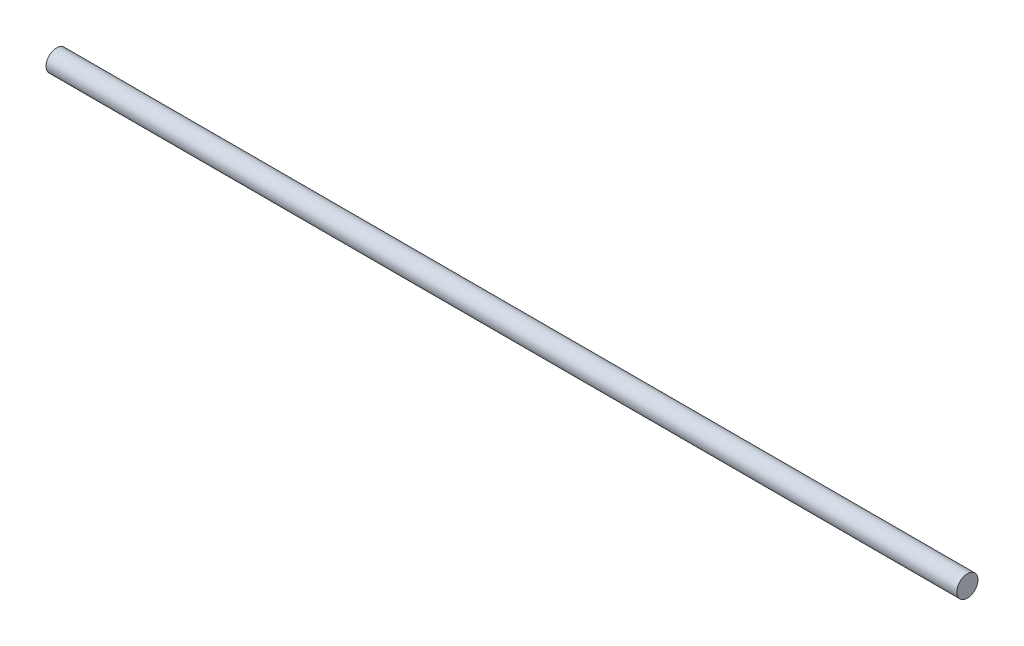
ISO-10303-21;
HEADER;
FILE_DESCRIPTION(('STEP AP214'),'2;1');
FILE_NAME('part.step','',(''),(''),'','','');
FILE_SCHEMA(('AUTOMOTIVE_DESIGN { 1 0 10303 214 1 1 1 1 }'));
ENDSEC;
DATA;
#1=APPLICATION_CONTEXT('core data for automotive mechanical design processes');
#2=APPLICATION_PROTOCOL_DEFINITION('international standard','automotive_design',2000,#1);
#3=PRODUCT_CONTEXT('',#1,'mechanical');
#4=PRODUCT('Part','Part','',(#3));
#5=PRODUCT_RELATED_PRODUCT_CATEGORY('part','',(#4));
#6=PRODUCT_DEFINITION_FORMATION('','',#4);
#7=PRODUCT_DEFINITION_CONTEXT('part definition',#1,'design');
#8=PRODUCT_DEFINITION('design','',#6,#7);
#9=PRODUCT_DEFINITION_SHAPE('','',#8);
#10=(LENGTH_UNIT() NAMED_UNIT(*) SI_UNIT(.MILLI.,.METRE.));
#11=(NAMED_UNIT(*) PLANE_ANGLE_UNIT() SI_UNIT($,.RADIAN.));
#12=(NAMED_UNIT(*) SI_UNIT($,.STERADIAN.) SOLID_ANGLE_UNIT());
#13=UNCERTAINTY_MEASURE_WITH_UNIT(LENGTH_MEASURE(1.E-05),#10,'distance_accuracy_value','');
#14=(GEOMETRIC_REPRESENTATION_CONTEXT(3) GLOBAL_UNCERTAINTY_ASSIGNED_CONTEXT((#13)) GLOBAL_UNIT_ASSIGNED_CONTEXT((#10,
#11,#12)) REPRESENTATION_CONTEXT('',''));
#15=CARTESIAN_POINT('',(0.,0.,0.));
#16=DIRECTION('',(0.,0.,1.));
#17=DIRECTION('',(1.,0.,0.));
#18=AXIS2_PLACEMENT_3D('',#15,#16,#17);
#19=CARTESIAN_POINT('',(257.5,0.,0.));
#20=DIRECTION('',(-1.,0.,0.));
#21=DIRECTION('',(0.,0.,1.));
#22=AXIS2_PLACEMENT_3D('',#19,#20,#21);
#23=CYLINDRICAL_SURFACE('',#22,6.);
#24=CARTESIAN_POINT('',(257.5,0.,0.));
#25=DIRECTION('',(1.,0.,0.));
#26=DIRECTION('',(0.,1.,0.));
#27=AXIS2_PLACEMENT_3D('',#24,#25,#26);
#28=CIRCLE('',#27,6.);
#29=CARTESIAN_POINT('',(257.5,6.,0.));
#30=VERTEX_POINT('',#29);
#31=EDGE_CURVE('E10',#30,#30,#28,.T.);
#32=ORIENTED_EDGE('',*,*,#31,.F.);
#33=EDGE_LOOP('',(#32));
#34=FACE_BOUND('',#33,.T.);
#35=CARTESIAN_POINT('',(-257.5,0.,0.));
#36=DIRECTION('',(1.,0.,0.));
#37=DIRECTION('',(0.,1.,0.));
#38=AXIS2_PLACEMENT_3D('',#35,#36,#37);
#39=CIRCLE('',#38,6.);
#40=CARTESIAN_POINT('',(-257.5,6.,0.));
#41=VERTEX_POINT('',#40);
#42=EDGE_CURVE('E18',#41,#41,#39,.T.);
#43=ORIENTED_EDGE('',*,*,#42,.T.);
#44=EDGE_LOOP('',(#43));
#45=FACE_BOUND('',#44,.T.);
#46=ADVANCED_FACE('F15',(#34,#45),#23,.T.);
#47=CARTESIAN_POINT('',(257.5,0.,0.));
#48=DIRECTION('',(1.,0.,0.));
#49=DIRECTION('',(0.,1.,0.));
#50=AXIS2_PLACEMENT_3D('',#47,#48,#49);
#51=PLANE('',#50);
#52=ORIENTED_EDGE('',*,*,#31,.T.);
#53=EDGE_LOOP('',(#52));
#54=FACE_BOUND('',#53,.T.);
#55=ADVANCED_FACE('F36',(#54),#51,.T.);
#56=CARTESIAN_POINT('',(-257.5,0.,0.));
#57=DIRECTION('',(1.,0.,0.));
#58=DIRECTION('',(0.,1.,0.));
#59=AXIS2_PLACEMENT_3D('',#56,#57,#58);
#60=PLANE('',#59);
#61=ORIENTED_EDGE('',*,*,#42,.F.);
#62=EDGE_LOOP('',(#61));
#63=FACE_BOUND('',#62,.T.);
#64=ADVANCED_FACE('F34',(#63),#60,.F.);
#65=CLOSED_SHELL('',(#46,#55,#64));
#66=MANIFOLD_SOLID_BREP('B1',#65);
#67=ADVANCED_BREP_SHAPE_REPRESENTATION('',(#18,#66),#14);
#68=SHAPE_DEFINITION_REPRESENTATION(#9,#67);
ENDSEC;
END-ISO-10303-21;
